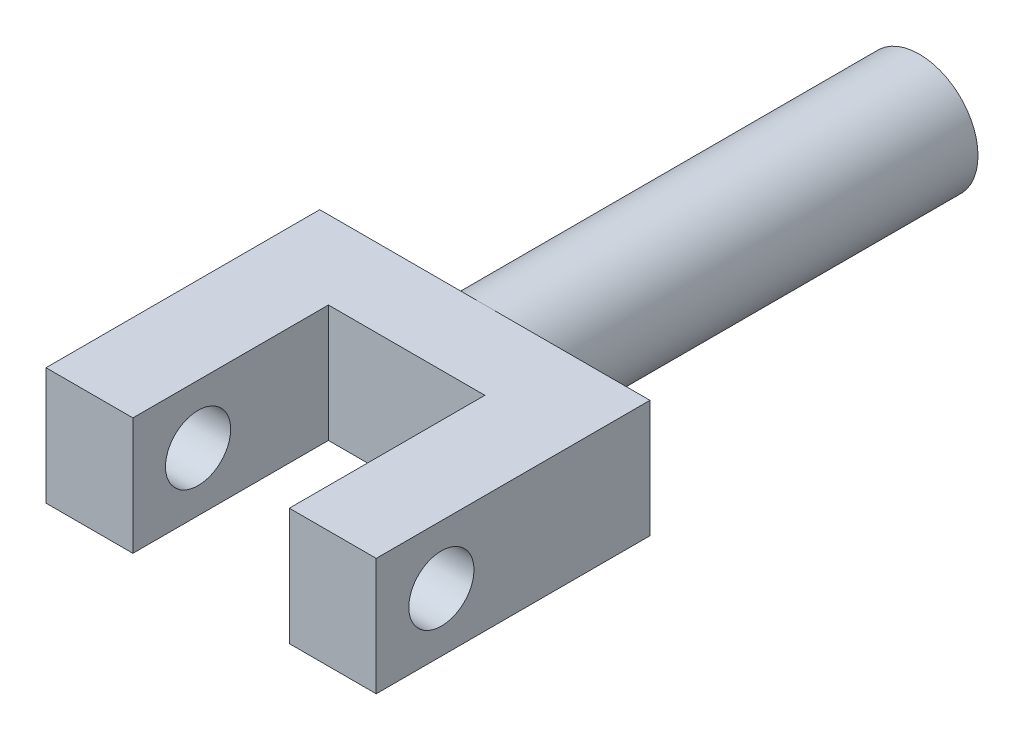
ISO-10303-21;
HEADER;
FILE_DESCRIPTION(('STEP AP214'),'2;1');
FILE_NAME('part.step','',(''),(''),'','','');
FILE_SCHEMA(('AUTOMOTIVE_DESIGN { 1 0 10303 214 1 1 1 1 }'));
ENDSEC;
DATA;
#1=APPLICATION_CONTEXT('core data for automotive mechanical design processes');
#2=APPLICATION_PROTOCOL_DEFINITION('international standard','automotive_design',2000,#1);
#3=PRODUCT_CONTEXT('',#1,'mechanical');
#4=PRODUCT('Part','Part','',(#3));
#5=PRODUCT_RELATED_PRODUCT_CATEGORY('part','',(#4));
#6=PRODUCT_DEFINITION_FORMATION('','',#4);
#7=PRODUCT_DEFINITION_CONTEXT('part definition',#1,'design');
#8=PRODUCT_DEFINITION('design','',#6,#7);
#9=PRODUCT_DEFINITION_SHAPE('','',#8);
#10=(LENGTH_UNIT() NAMED_UNIT(*) SI_UNIT(.MILLI.,.METRE.));
#11=(NAMED_UNIT(*) PLANE_ANGLE_UNIT() SI_UNIT($,.RADIAN.));
#12=(NAMED_UNIT(*) SI_UNIT($,.STERADIAN.) SOLID_ANGLE_UNIT());
#13=UNCERTAINTY_MEASURE_WITH_UNIT(LENGTH_MEASURE(1.E-05),#10,'distance_accuracy_value','');
#14=(GEOMETRIC_REPRESENTATION_CONTEXT(3) GLOBAL_UNCERTAINTY_ASSIGNED_CONTEXT((#13)) GLOBAL_UNIT_ASSIGNED_CONTEXT((#10,
#11,#12)) REPRESENTATION_CONTEXT('',''));
#15=CARTESIAN_POINT('',(0.,0.,0.));
#16=DIRECTION('',(0.,0.,1.));
#17=DIRECTION('',(1.,0.,0.));
#18=AXIS2_PLACEMENT_3D('',#15,#16,#17);
#19=CARTESIAN_POINT('',(0.,0.,10.));
#20=DIRECTION('',(0.,0.,-1.));
#21=DIRECTION('',(-1.,0.,0.));
#22=AXIS2_PLACEMENT_3D('',#19,#20,#21);
#23=CYLINDRICAL_SURFACE('',#22,1.35);
#24=CARTESIAN_POINT('',(0.,0.,10.));
#25=DIRECTION('',(0.,0.,1.));
#26=DIRECTION('',(1.,0.,0.));
#27=AXIS2_PLACEMENT_3D('',#24,#25,#26);
#28=CIRCLE('',#27,1.35);
#29=CARTESIAN_POINT('',(0.,1.35,10.));
#30=VERTEX_POINT('',#29);
#31=CARTESIAN_POINT('',(0.,-1.35,10.));
#32=VERTEX_POINT('',#31);
#33=EDGE_CURVE('E11',#30,#32,#28,.T.);
#34=ORIENTED_EDGE('',*,*,#33,.F.);
#35=EDGE_CURVE('E48',#32,#30,#28,.T.);
#36=ORIENTED_EDGE('',*,*,#35,.F.);
#37=EDGE_LOOP('',(#34,#36));
#38=FACE_BOUND('',#37,.T.);
#39=CARTESIAN_POINT('',(0.,0.,0.));
#40=DIRECTION('',(0.,0.,1.));
#41=DIRECTION('',(1.,0.,0.));
#42=AXIS2_PLACEMENT_3D('',#39,#40,#41);
#43=CIRCLE('',#42,1.35);
#44=CARTESIAN_POINT('',(1.35,0.,0.));
#45=VERTEX_POINT('',#44);
#46=EDGE_CURVE('E194',#45,#45,#43,.T.);
#47=ORIENTED_EDGE('',*,*,#46,.T.);
#48=EDGE_LOOP('',(#47));
#49=FACE_BOUND('',#48,.T.);
#50=ADVANCED_FACE('F39',(#38,#49),#23,.T.);
#51=CARTESIAN_POINT('',(0.,0.,0.));
#52=DIRECTION('',(0.,0.,1.));
#53=DIRECTION('',(1.,0.,0.));
#54=AXIS2_PLACEMENT_3D('',#51,#52,#53);
#55=PLANE('',#54);
#56=ORIENTED_EDGE('',*,*,#46,.F.);
#57=EDGE_LOOP('',(#56));
#58=FACE_BOUND('',#57,.T.);
#59=ADVANCED_FACE('F255',(#58),#55,.F.);
#60=CARTESIAN_POINT('',(0.,-1.35,10.));
#61=DIRECTION('',(0.,0.,-1.));
#62=DIRECTION('',(-1.,0.,0.));
#63=AXIS2_PLACEMENT_3D('',#60,#61,#62);
#64=PLANE('',#63);
#65=DIRECTION('',(-1.,0.,0.));
#66=VECTOR('',#65,1.);
#67=CARTESIAN_POINT('',(3.8,1.35,10.));
#68=LINE('',#67,#66);
#69=CARTESIAN_POINT('',(-3.8,1.35,10.));
#70=VERTEX_POINT('',#69);
#71=EDGE_CURVE('E107',#30,#70,#68,.T.);
#72=ORIENTED_EDGE('',*,*,#71,.F.);
#73=ORIENTED_EDGE('',*,*,#33,.T.);
#74=DIRECTION('',(-1.,0.,0.));
#75=VECTOR('',#74,1.);
#76=CARTESIAN_POINT('',(3.8,-1.35,10.));
#77=LINE('',#76,#75);
#78=CARTESIAN_POINT('',(-3.8,-1.35,10.));
#79=VERTEX_POINT('',#78);
#80=EDGE_CURVE('E125',#32,#79,#77,.T.);
#81=ORIENTED_EDGE('',*,*,#80,.T.);
#82=DIRECTION('',(0.,1.,0.));
#83=VECTOR('',#82,1.);
#84=CARTESIAN_POINT('',(-3.8,-1.35,10.));
#85=LINE('',#84,#83);
#86=EDGE_CURVE('E122',#79,#70,#85,.T.);
#87=ORIENTED_EDGE('',*,*,#86,.T.);
#88=EDGE_LOOP('',(#72,#73,#81,#87));
#89=FACE_BOUND('',#88,.T.);
#90=ADVANCED_FACE('F123',(#89),#64,.T.);
#91=CARTESIAN_POINT('',(3.8,-1.35,16.3));
#92=DIRECTION('',(1.,0.,0.));
#93=DIRECTION('',(0.,0.,-1.));
#94=AXIS2_PLACEMENT_3D('',#91,#92,#93);
#95=PLANE('',#94);
#96=CARTESIAN_POINT('',(3.8,0.,14.8));
#97=DIRECTION('',(1.,0.,0.));
#98=DIRECTION('',(0.,0.,-1.));
#99=AXIS2_PLACEMENT_3D('',#96,#97,#98);
#100=CIRCLE('',#99,0.75);
#101=CARTESIAN_POINT('',(3.8,0.,15.55));
#102=VERTEX_POINT('',#101);
#103=EDGE_CURVE('E119',#102,#102,#100,.F.);
#104=ORIENTED_EDGE('',*,*,#103,.T.);
#105=EDGE_LOOP('',(#104));
#106=FACE_BOUND('',#105,.T.);
#107=DIRECTION('',(0.,1.,0.));
#108=VECTOR('',#107,1.);
#109=CARTESIAN_POINT('',(3.8,-1.35,10.));
#110=LINE('',#109,#108);
#111=CARTESIAN_POINT('',(3.8,-1.35,10.));
#112=VERTEX_POINT('',#111);
#113=CARTESIAN_POINT('',(3.8,1.35,10.));
#114=VERTEX_POINT('',#113);
#115=EDGE_CURVE('E191',#112,#114,#110,.T.);
#116=ORIENTED_EDGE('',*,*,#115,.T.);
#117=DIRECTION('',(0.,0.,-1.));
#118=VECTOR('',#117,1.);
#119=CARTESIAN_POINT('',(3.8,1.35,16.3));
#120=LINE('',#119,#118);
#121=CARTESIAN_POINT('',(3.8,1.35,16.3));
#122=VERTEX_POINT('',#121);
#123=EDGE_CURVE('E158',#122,#114,#120,.T.);
#124=ORIENTED_EDGE('',*,*,#123,.F.);
#125=DIRECTION('',(0.,1.,0.));
#126=VECTOR('',#125,1.);
#127=CARTESIAN_POINT('',(3.8,-1.35,16.3));
#128=LINE('',#127,#126);
#129=CARTESIAN_POINT('',(3.8,-1.35,16.3));
#130=VERTEX_POINT('',#129);
#131=EDGE_CURVE('E195',#130,#122,#128,.T.);
#132=ORIENTED_EDGE('',*,*,#131,.F.);
#133=DIRECTION('',(0.,0.,-1.));
#134=VECTOR('',#133,1.);
#135=CARTESIAN_POINT('',(3.8,-1.35,16.3));
#136=LINE('',#135,#134);
#137=EDGE_CURVE('E131',#130,#112,#136,.T.);
#138=ORIENTED_EDGE('',*,*,#137,.T.);
#139=EDGE_LOOP('',(#116,#124,#132,#138));
#140=FACE_BOUND('',#139,.T.);
#141=ADVANCED_FACE('F224',(#106,#140),#95,.T.);
#142=CARTESIAN_POINT('',(1.8,-1.35,16.3));
#143=DIRECTION('',(0.,0.,1.));
#144=DIRECTION('',(1.,0.,0.));
#145=AXIS2_PLACEMENT_3D('',#142,#143,#144);
#146=PLANE('',#145);
#147=ORIENTED_EDGE('',*,*,#131,.T.);
#148=DIRECTION('',(1.,0.,0.));
#149=VECTOR('',#148,1.);
#150=CARTESIAN_POINT('',(1.8,1.35,16.3));
#151=LINE('',#150,#149);
#152=CARTESIAN_POINT('',(1.8,1.35,16.3));
#153=VERTEX_POINT('',#152);
#154=EDGE_CURVE('E154',#153,#122,#151,.T.);
#155=ORIENTED_EDGE('',*,*,#154,.F.);
#156=DIRECTION('',(0.,1.,0.));
#157=VECTOR('',#156,1.);
#158=CARTESIAN_POINT('',(1.8,-1.35,16.3));
#159=LINE('',#158,#157);
#160=CARTESIAN_POINT('',(1.8,-1.35,16.3));
#161=VERTEX_POINT('',#160);
#162=EDGE_CURVE('E198',#161,#153,#159,.T.);
#163=ORIENTED_EDGE('',*,*,#162,.F.);
#164=DIRECTION('',(1.,0.,0.));
#165=VECTOR('',#164,1.);
#166=CARTESIAN_POINT('',(1.8,-1.35,16.3));
#167=LINE('',#166,#165);
#168=EDGE_CURVE('E184',#161,#130,#167,.T.);
#169=ORIENTED_EDGE('',*,*,#168,.T.);
#170=EDGE_LOOP('',(#147,#155,#163,#169));
#171=FACE_BOUND('',#170,.T.);
#172=ADVANCED_FACE('F228',(#171),#146,.T.);
#173=CARTESIAN_POINT('',(1.8,-1.35,11.8));
#174=DIRECTION('',(-1.,0.,0.));
#175=DIRECTION('',(0.,0.,1.));
#176=AXIS2_PLACEMENT_3D('',#173,#174,#175);
#177=PLANE('',#176);
#178=CARTESIAN_POINT('',(1.8,0.,14.8));
#179=DIRECTION('',(-1.,0.,0.));
#180=DIRECTION('',(0.,0.,1.));
#181=AXIS2_PLACEMENT_3D('',#178,#179,#180);
#182=CIRCLE('',#181,0.75);
#183=CARTESIAN_POINT('',(1.8,0.,15.55));
#184=VERTEX_POINT('',#183);
#185=EDGE_CURVE('E332',#184,#184,#182,.F.);
#186=ORIENTED_EDGE('',*,*,#185,.T.);
#187=EDGE_LOOP('',(#186));
#188=FACE_BOUND('',#187,.T.);
#189=ORIENTED_EDGE('',*,*,#162,.T.);
#190=DIRECTION('',(0.,0.,1.));
#191=VECTOR('',#190,1.);
#192=CARTESIAN_POINT('',(1.8,1.35,11.8));
#193=LINE('',#192,#191);
#194=CARTESIAN_POINT('',(1.8,1.35,11.8));
#195=VERTEX_POINT('',#194);
#196=EDGE_CURVE('E150',#195,#153,#193,.T.);
#197=ORIENTED_EDGE('',*,*,#196,.F.);
#198=DIRECTION('',(0.,1.,0.));
#199=VECTOR('',#198,1.);
#200=CARTESIAN_POINT('',(1.8,-1.35,11.8));
#201=LINE('',#200,#199);
#202=CARTESIAN_POINT('',(1.8,-1.35,11.8));
#203=VERTEX_POINT('',#202);
#204=EDGE_CURVE('E201',#203,#195,#201,.T.);
#205=ORIENTED_EDGE('',*,*,#204,.F.);
#206=DIRECTION('',(0.,0.,1.));
#207=VECTOR('',#206,1.);
#208=CARTESIAN_POINT('',(1.8,-1.35,11.8));
#209=LINE('',#208,#207);
#210=EDGE_CURVE('E180',#203,#161,#209,.T.);
#211=ORIENTED_EDGE('',*,*,#210,.T.);
#212=EDGE_LOOP('',(#189,#197,#205,#211));
#213=FACE_BOUND('',#212,.T.);
#214=ADVANCED_FACE('F232',(#188,#213),#177,.T.);
#215=CARTESIAN_POINT('',(-1.8,-1.35,11.8));
#216=DIRECTION('',(0.,0.,1.));
#217=DIRECTION('',(1.,0.,0.));
#218=AXIS2_PLACEMENT_3D('',#215,#216,#217);
#219=PLANE('',#218);
#220=ORIENTED_EDGE('',*,*,#204,.T.);
#221=DIRECTION('',(1.,0.,0.));
#222=VECTOR('',#221,1.);
#223=CARTESIAN_POINT('',(-1.8,1.35,11.8));
#224=LINE('',#223,#222);
#225=CARTESIAN_POINT('',(-1.8,1.35,11.8));
#226=VERTEX_POINT('',#225);
#227=EDGE_CURVE('E146',#226,#195,#224,.T.);
#228=ORIENTED_EDGE('',*,*,#227,.F.);
#229=DIRECTION('',(0.,1.,0.));
#230=VECTOR('',#229,1.);
#231=CARTESIAN_POINT('',(-1.8,-1.35,11.8));
#232=LINE('',#231,#230);
#233=CARTESIAN_POINT('',(-1.8,-1.35,11.8));
#234=VERTEX_POINT('',#233);
#235=EDGE_CURVE('E204',#234,#226,#232,.T.);
#236=ORIENTED_EDGE('',*,*,#235,.F.);
#237=DIRECTION('',(1.,0.,0.));
#238=VECTOR('',#237,1.);
#239=CARTESIAN_POINT('',(-1.8,-1.35,11.8));
#240=LINE('',#239,#238);
#241=EDGE_CURVE('E176',#234,#203,#240,.T.);
#242=ORIENTED_EDGE('',*,*,#241,.T.);
#243=EDGE_LOOP('',(#220,#228,#236,#242));
#244=FACE_BOUND('',#243,.T.);
#245=ADVANCED_FACE('F236',(#244),#219,.T.);
#246=CARTESIAN_POINT('',(-1.8,-1.35,16.3));
#247=DIRECTION('',(1.,0.,0.));
#248=DIRECTION('',(0.,0.,-1.));
#249=AXIS2_PLACEMENT_3D('',#246,#247,#248);
#250=PLANE('',#249);
#251=CARTESIAN_POINT('',(-1.8,0.,14.8));
#252=DIRECTION('',(1.,0.,0.));
#253=DIRECTION('',(0.,0.,-1.));
#254=AXIS2_PLACEMENT_3D('',#251,#252,#253);
#255=CIRCLE('',#254,0.75);
#256=CARTESIAN_POINT('',(-1.8,0.,15.55));
#257=VERTEX_POINT('',#256);
#258=EDGE_CURVE('E334',#257,#257,#255,.F.);
#259=ORIENTED_EDGE('',*,*,#258,.T.);
#260=EDGE_LOOP('',(#259));
#261=FACE_BOUND('',#260,.T.);
#262=ORIENTED_EDGE('',*,*,#235,.T.);
#263=DIRECTION('',(0.,0.,-1.));
#264=VECTOR('',#263,1.);
#265=CARTESIAN_POINT('',(-1.8,1.35,16.3));
#266=LINE('',#265,#264);
#267=CARTESIAN_POINT('',(-1.8,1.35,16.3));
#268=VERTEX_POINT('',#267);
#269=EDGE_CURVE('E139',#268,#226,#266,.T.);
#270=ORIENTED_EDGE('',*,*,#269,.F.);
#271=DIRECTION('',(0.,1.,0.));
#272=VECTOR('',#271,1.);
#273=CARTESIAN_POINT('',(-1.8,-1.35,16.3));
#274=LINE('',#273,#272);
#275=CARTESIAN_POINT('',(-1.8,-1.35,16.3));
#276=VERTEX_POINT('',#275);
#277=EDGE_CURVE('E207',#276,#268,#274,.T.);
#278=ORIENTED_EDGE('',*,*,#277,.F.);
#279=DIRECTION('',(0.,0.,-1.));
#280=VECTOR('',#279,1.);
#281=CARTESIAN_POINT('',(-1.8,-1.35,16.3));
#282=LINE('',#281,#280);
#283=EDGE_CURVE('E172',#276,#234,#282,.T.);
#284=ORIENTED_EDGE('',*,*,#283,.T.);
#285=EDGE_LOOP('',(#262,#270,#278,#284));
#286=FACE_BOUND('',#285,.T.);
#287=ADVANCED_FACE('F239',(#261,#286),#250,.T.);
#288=CARTESIAN_POINT('',(-3.8,-1.35,16.3));
#289=DIRECTION('',(0.,0.,1.));
#290=DIRECTION('',(1.,0.,0.));
#291=AXIS2_PLACEMENT_3D('',#288,#289,#290);
#292=PLANE('',#291);
#293=ORIENTED_EDGE('',*,*,#277,.T.);
#294=DIRECTION('',(1.,0.,0.));
#295=VECTOR('',#294,1.);
#296=CARTESIAN_POINT('',(-3.8,1.35,16.3));
#297=LINE('',#296,#295);
#298=CARTESIAN_POINT('',(-3.8,1.35,16.3));
#299=VERTEX_POINT('',#298);
#300=EDGE_CURVE('E135',#299,#268,#297,.T.);
#301=ORIENTED_EDGE('',*,*,#300,.F.);
#302=DIRECTION('',(0.,1.,0.));
#303=VECTOR('',#302,1.);
#304=CARTESIAN_POINT('',(-3.8,-1.35,16.3));
#305=LINE('',#304,#303);
#306=CARTESIAN_POINT('',(-3.8,-1.35,16.3));
#307=VERTEX_POINT('',#306);
#308=EDGE_CURVE('E130',#307,#299,#305,.T.);
#309=ORIENTED_EDGE('',*,*,#308,.F.);
#310=DIRECTION('',(1.,0.,0.));
#311=VECTOR('',#310,1.);
#312=CARTESIAN_POINT('',(-3.8,-1.35,16.3));
#313=LINE('',#312,#311);
#314=EDGE_CURVE('E168',#307,#276,#313,.T.);
#315=ORIENTED_EDGE('',*,*,#314,.T.);
#316=EDGE_LOOP('',(#293,#301,#309,#315));
#317=FACE_BOUND('',#316,.T.);
#318=ADVANCED_FACE('F243',(#317),#292,.T.);
#319=CARTESIAN_POINT('',(-3.8,-1.35,10.));
#320=DIRECTION('',(-1.,0.,0.));
#321=DIRECTION('',(0.,0.,1.));
#322=AXIS2_PLACEMENT_3D('',#319,#320,#321);
#323=PLANE('',#322);
#324=CARTESIAN_POINT('',(-3.8,0.,14.8));
#325=DIRECTION('',(-1.,0.,0.));
#326=DIRECTION('',(0.,0.,1.));
#327=AXIS2_PLACEMENT_3D('',#324,#325,#326);
#328=CIRCLE('',#327,0.75);
#329=CARTESIAN_POINT('',(-3.8,0.,15.55));
#330=VERTEX_POINT('',#329);
#331=EDGE_CURVE('E42',#330,#330,#328,.F.);
#332=ORIENTED_EDGE('',*,*,#331,.T.);
#333=EDGE_LOOP('',(#332));
#334=FACE_BOUND('',#333,.T.);
#335=ORIENTED_EDGE('',*,*,#308,.T.);
#336=DIRECTION('',(0.,0.,1.));
#337=VECTOR('',#336,1.);
#338=CARTESIAN_POINT('',(-3.8,1.35,10.));
#339=LINE('',#338,#337);
#340=EDGE_CURVE('E112',#70,#299,#339,.T.);
#341=ORIENTED_EDGE('',*,*,#340,.F.);
#342=ORIENTED_EDGE('',*,*,#86,.F.);
#343=DIRECTION('',(0.,0.,1.));
#344=VECTOR('',#343,1.);
#345=CARTESIAN_POINT('',(-3.8,-1.35,10.));
#346=LINE('',#345,#344);
#347=EDGE_CURVE('E165',#79,#307,#346,.T.);
#348=ORIENTED_EDGE('',*,*,#347,.T.);
#349=EDGE_LOOP('',(#335,#341,#342,#348));
#350=FACE_BOUND('',#349,.T.);
#351=ADVANCED_FACE('F133',(#334,#350),#323,.T.);
#352=EDGE_CURVE('E161',#112,#32,#77,.T.);
#353=ORIENTED_EDGE('',*,*,#352,.T.);
#354=ORIENTED_EDGE('',*,*,#35,.T.);
#355=EDGE_CURVE('E116',#114,#30,#68,.T.);
#356=ORIENTED_EDGE('',*,*,#355,.F.);
#357=ORIENTED_EDGE('',*,*,#115,.F.);
#358=EDGE_LOOP('',(#353,#354,#356,#357));
#359=FACE_BOUND('',#358,.T.);
#360=ADVANCED_FACE('F217',(#359),#64,.T.);
#361=CARTESIAN_POINT('',(0.,-1.35,0.));
#362=DIRECTION('',(0.,1.,0.));
#363=DIRECTION('',(0.,0.,1.));
#364=AXIS2_PLACEMENT_3D('',#361,#362,#363);
#365=PLANE('',#364);
#366=ORIENTED_EDGE('',*,*,#352,.F.);
#367=ORIENTED_EDGE('',*,*,#137,.F.);
#368=ORIENTED_EDGE('',*,*,#168,.F.);
#369=ORIENTED_EDGE('',*,*,#210,.F.);
#370=ORIENTED_EDGE('',*,*,#241,.F.);
#371=ORIENTED_EDGE('',*,*,#283,.F.);
#372=ORIENTED_EDGE('',*,*,#314,.F.);
#373=ORIENTED_EDGE('',*,*,#347,.F.);
#374=ORIENTED_EDGE('',*,*,#80,.F.);
#375=EDGE_LOOP('',(#366,#367,#368,#369,#370,#371,#372,#373,#374));
#376=FACE_BOUND('',#375,.T.);
#377=ADVANCED_FACE('F221',(#376),#365,.F.);
#378=CARTESIAN_POINT('',(0.,1.35,0.));
#379=DIRECTION('',(0.,1.,0.));
#380=DIRECTION('',(0.,0.,1.));
#381=AXIS2_PLACEMENT_3D('',#378,#379,#380);
#382=PLANE('',#381);
#383=ORIENTED_EDGE('',*,*,#355,.T.);
#384=ORIENTED_EDGE('',*,*,#71,.T.);
#385=ORIENTED_EDGE('',*,*,#340,.T.);
#386=ORIENTED_EDGE('',*,*,#300,.T.);
#387=ORIENTED_EDGE('',*,*,#269,.T.);
#388=ORIENTED_EDGE('',*,*,#227,.T.);
#389=ORIENTED_EDGE('',*,*,#196,.T.);
#390=ORIENTED_EDGE('',*,*,#154,.T.);
#391=ORIENTED_EDGE('',*,*,#123,.T.);
#392=EDGE_LOOP('',(#383,#384,#385,#386,#387,#388,#389,#390,#391));
#393=FACE_BOUND('',#392,.T.);
#394=ADVANCED_FACE('F109',(#393),#382,.T.);
#395=CARTESIAN_POINT('',(9.45,0.,14.8));
#396=DIRECTION('',(-1.,0.,0.));
#397=DIRECTION('',(0.,0.,1.));
#398=AXIS2_PLACEMENT_3D('',#395,#396,#397);
#399=CYLINDRICAL_SURFACE('',#398,0.75);
#400=CARTESIAN_POINT('',(-1.8,0.,15.55));
#401=CARTESIAN_POINT('',(-1.82083333333333,0.,15.55));
#402=CARTESIAN_POINT('',(-1.84166666666666,0.,15.55));
#403=CARTESIAN_POINT('',(-1.88333333333333,0.,15.55));
#404=CARTESIAN_POINT('',(-1.90416666666666,0.,15.55));
#405=CARTESIAN_POINT('',(-1.94583333333333,0.,15.55));
#406=CARTESIAN_POINT('',(-1.96666666666666,0.,15.55));
#407=CARTESIAN_POINT('',(-2.00833333333333,0.,15.55));
#408=CARTESIAN_POINT('',(-2.02916666666667,0.,15.55));
#409=CARTESIAN_POINT('',(-2.07083333333333,0.,15.55));
#410=CARTESIAN_POINT('',(-2.09166666666667,0.,15.55));
#411=CARTESIAN_POINT('',(-2.13333333333333,0.,15.55));
#412=CARTESIAN_POINT('',(-2.15416666666667,0.,15.55));
#413=CARTESIAN_POINT('',(-2.19583333333333,0.,15.55));
#414=CARTESIAN_POINT('',(-2.21666666666667,0.,15.55));
#415=CARTESIAN_POINT('',(-2.25833333333333,0.,15.55));
#416=CARTESIAN_POINT('',(-2.27916666666667,0.,15.55));
#417=CARTESIAN_POINT('',(-2.32083333333333,0.,15.55));
#418=CARTESIAN_POINT('',(-2.34166666666667,0.,15.55));
#419=CARTESIAN_POINT('',(-2.38333333333333,0.,15.55));
#420=CARTESIAN_POINT('',(-2.40416666666667,0.,15.55));
#421=CARTESIAN_POINT('',(-2.44583333333333,0.,15.55));
#422=CARTESIAN_POINT('',(-2.46666666666667,0.,15.55));
#423=CARTESIAN_POINT('',(-2.50833333333333,0.,15.55));
#424=CARTESIAN_POINT('',(-2.52916666666667,0.,15.55));
#425=CARTESIAN_POINT('',(-2.57083333333333,0.,15.55));
#426=CARTESIAN_POINT('',(-2.59166666666667,0.,15.55));
#427=CARTESIAN_POINT('',(-2.63333333333333,0.,15.55));
#428=CARTESIAN_POINT('',(-2.65416666666667,0.,15.55));
#429=CARTESIAN_POINT('',(-2.69583333333333,0.,15.55));
#430=CARTESIAN_POINT('',(-2.71666666666667,0.,15.55));
#431=CARTESIAN_POINT('',(-2.75833333333333,0.,15.55));
#432=CARTESIAN_POINT('',(-2.77916666666667,0.,15.55));
#433=CARTESIAN_POINT('',(-2.82083333333333,0.,15.55));
#434=CARTESIAN_POINT('',(-2.84166666666667,0.,15.55));
#435=CARTESIAN_POINT('',(-2.88333333333333,0.,15.55));
#436=CARTESIAN_POINT('',(-2.90416666666667,0.,15.55));
#437=CARTESIAN_POINT('',(-2.94583333333333,0.,15.55));
#438=CARTESIAN_POINT('',(-2.96666666666667,0.,15.55));
#439=CARTESIAN_POINT('',(-3.00833333333333,0.,15.55));
#440=CARTESIAN_POINT('',(-3.02916666666667,0.,15.55));
#441=CARTESIAN_POINT('',(-3.07083333333333,0.,15.55));
#442=CARTESIAN_POINT('',(-3.09166666666667,0.,15.55));
#443=CARTESIAN_POINT('',(-3.13333333333333,0.,15.55));
#444=CARTESIAN_POINT('',(-3.15416666666667,0.,15.55));
#445=CARTESIAN_POINT('',(-3.19583333333333,0.,15.55));
#446=CARTESIAN_POINT('',(-3.21666666666667,0.,15.55));
#447=CARTESIAN_POINT('',(-3.25833333333333,0.,15.55));
#448=CARTESIAN_POINT('',(-3.27916666666667,0.,15.55));
#449=CARTESIAN_POINT('',(-3.32083333333333,0.,15.55));
#450=CARTESIAN_POINT('',(-3.34166666666667,0.,15.55));
#451=CARTESIAN_POINT('',(-3.38333333333333,0.,15.55));
#452=CARTESIAN_POINT('',(-3.40416666666667,0.,15.55));
#453=CARTESIAN_POINT('',(-3.44583333333333,0.,15.55));
#454=CARTESIAN_POINT('',(-3.46666666666667,0.,15.55));
#455=CARTESIAN_POINT('',(-3.50833333333333,0.,15.55));
#456=CARTESIAN_POINT('',(-3.52916666666667,0.,15.55));
#457=CARTESIAN_POINT('',(-3.57083333333333,0.,15.55));
#458=CARTESIAN_POINT('',(-3.59166666666667,0.,15.55));
#459=CARTESIAN_POINT('',(-3.63333333333333,0.,15.55));
#460=CARTESIAN_POINT('',(-3.65416666666667,0.,15.55));
#461=CARTESIAN_POINT('',(-3.69583333333333,0.,15.55));
#462=CARTESIAN_POINT('',(-3.71666666666667,0.,15.55));
#463=CARTESIAN_POINT('',(-3.75833333333333,0.,15.55));
#464=CARTESIAN_POINT('',(-3.77916666666667,0.,15.55));
#465=CARTESIAN_POINT('',(-3.8,0.,15.55));
#466=B_SPLINE_CURVE_WITH_KNOTS('',3,(#400,#401,#402,#403,#404,#405,#406,#407,#408,#409,#410,
#411,#412,#413,#414,#415,#416,#417,#418,#419,#420,#421,#422,#423,#424,#425,#426,#427,#428,#429,
#430,#431,#432,#433,#434,#435,#436,#437,#438,#439,#440,#441,#442,#443,#444,#445,#446,#447,#448,
#449,#450,#451,#452,#453,#454,#455,#456,#457,#458,#459,#460,#461,#462,#463,#464,#465),
.UNSPECIFIED.,.F.,.F.,(4,2,2,2,2,2,2,2,2,2,2,2,2,2,2,2,2,2,2,2,2,2,2,2,2,2,2,2,2,2,2,2,4),(0.,
0.0625000000000001,0.125,0.1875,0.25,0.3125,0.375,0.4375,0.5,0.5625,0.625000000000001,
0.687500000000001,0.750000000000001,0.812500000000001,0.875000000000001,0.937500000000001,1.,
1.0625,1.125,1.1875,1.25,1.3125,1.375,1.4375,1.5,1.5625,1.625,1.6875,1.75,1.8125,1.875,1.9375,
2.),.UNSPECIFIED.);
#467=EDGE_CURVE('BSEAM272',#257,#330,#466,.T.);
#468=ORIENTED_EDGE('',*,*,#258,.F.);
#469=ORIENTED_EDGE('',*,*,#331,.F.);
#470=ORIENTED_EDGE('',*,*,#467,.T.);
#471=ORIENTED_EDGE('',*,*,#467,.F.);
#472=EDGE_LOOP('',(#468,#470,#469,#471));
#473=FACE_BOUND('',#472,.T.);
#474=ADVANCED_FACE('F272',(#473),#399,.F.);
#475=CARTESIAN_POINT('',(3.8,0.,15.55));
#476=CARTESIAN_POINT('',(3.77916666666667,0.,15.55));
#477=CARTESIAN_POINT('',(3.75833333333333,0.,15.55));
#478=CARTESIAN_POINT('',(3.71666666666667,0.,15.55));
#479=CARTESIAN_POINT('',(3.69583333333333,0.,15.55));
#480=CARTESIAN_POINT('',(3.65416666666667,0.,15.55));
#481=CARTESIAN_POINT('',(3.63333333333333,0.,15.55));
#482=CARTESIAN_POINT('',(3.59166666666667,0.,15.55));
#483=CARTESIAN_POINT('',(3.57083333333333,0.,15.55));
#484=CARTESIAN_POINT('',(3.52916666666667,0.,15.55));
#485=CARTESIAN_POINT('',(3.50833333333333,0.,15.55));
#486=CARTESIAN_POINT('',(3.46666666666667,0.,15.55));
#487=CARTESIAN_POINT('',(3.44583333333333,0.,15.55));
#488=CARTESIAN_POINT('',(3.40416666666667,0.,15.55));
#489=CARTESIAN_POINT('',(3.38333333333333,0.,15.55));
#490=CARTESIAN_POINT('',(3.34166666666667,0.,15.55));
#491=CARTESIAN_POINT('',(3.32083333333333,0.,15.55));
#492=CARTESIAN_POINT('',(3.27916666666667,0.,15.55));
#493=CARTESIAN_POINT('',(3.25833333333333,0.,15.55));
#494=CARTESIAN_POINT('',(3.21666666666667,0.,15.55));
#495=CARTESIAN_POINT('',(3.19583333333333,0.,15.55));
#496=CARTESIAN_POINT('',(3.15416666666667,0.,15.55));
#497=CARTESIAN_POINT('',(3.13333333333333,0.,15.55));
#498=CARTESIAN_POINT('',(3.09166666666667,0.,15.55));
#499=CARTESIAN_POINT('',(3.07083333333333,0.,15.55));
#500=CARTESIAN_POINT('',(3.02916666666667,0.,15.55));
#501=CARTESIAN_POINT('',(3.00833333333333,0.,15.55));
#502=CARTESIAN_POINT('',(2.96666666666667,0.,15.55));
#503=CARTESIAN_POINT('',(2.94583333333333,0.,15.55));
#504=CARTESIAN_POINT('',(2.90416666666667,0.,15.55));
#505=CARTESIAN_POINT('',(2.88333333333333,0.,15.55));
#506=CARTESIAN_POINT('',(2.84166666666667,0.,15.55));
#507=CARTESIAN_POINT('',(2.82083333333333,0.,15.55));
#508=CARTESIAN_POINT('',(2.77916666666667,0.,15.55));
#509=CARTESIAN_POINT('',(2.75833333333333,0.,15.55));
#510=CARTESIAN_POINT('',(2.71666666666667,0.,15.55));
#511=CARTESIAN_POINT('',(2.69583333333333,0.,15.55));
#512=CARTESIAN_POINT('',(2.65416666666667,0.,15.55));
#513=CARTESIAN_POINT('',(2.63333333333333,0.,15.55));
#514=CARTESIAN_POINT('',(2.59166666666667,0.,15.55));
#515=CARTESIAN_POINT('',(2.57083333333333,0.,15.55));
#516=CARTESIAN_POINT('',(2.52916666666667,0.,15.55));
#517=CARTESIAN_POINT('',(2.50833333333333,0.,15.55));
#518=CARTESIAN_POINT('',(2.46666666666667,0.,15.55));
#519=CARTESIAN_POINT('',(2.44583333333333,0.,15.55));
#520=CARTESIAN_POINT('',(2.40416666666667,0.,15.55));
#521=CARTESIAN_POINT('',(2.38333333333333,0.,15.55));
#522=CARTESIAN_POINT('',(2.34166666666667,0.,15.55));
#523=CARTESIAN_POINT('',(2.32083333333333,0.,15.55));
#524=CARTESIAN_POINT('',(2.27916666666667,0.,15.55));
#525=CARTESIAN_POINT('',(2.25833333333333,0.,15.55));
#526=CARTESIAN_POINT('',(2.21666666666667,0.,15.55));
#527=CARTESIAN_POINT('',(2.19583333333333,0.,15.55));
#528=CARTESIAN_POINT('',(2.15416666666667,0.,15.55));
#529=CARTESIAN_POINT('',(2.13333333333333,0.,15.55));
#530=CARTESIAN_POINT('',(2.09166666666667,0.,15.55));
#531=CARTESIAN_POINT('',(2.07083333333333,0.,15.55));
#532=CARTESIAN_POINT('',(2.02916666666667,0.,15.55));
#533=CARTESIAN_POINT('',(2.00833333333333,0.,15.55));
#534=CARTESIAN_POINT('',(1.96666666666667,0.,15.55));
#535=CARTESIAN_POINT('',(1.94583333333333,0.,15.55));
#536=CARTESIAN_POINT('',(1.90416666666667,0.,15.55));
#537=CARTESIAN_POINT('',(1.88333333333333,0.,15.55));
#538=CARTESIAN_POINT('',(1.84166666666667,0.,15.55));
#539=CARTESIAN_POINT('',(1.82083333333333,0.,15.55));
#540=CARTESIAN_POINT('',(1.8,0.,15.55));
#541=B_SPLINE_CURVE_WITH_KNOTS('',3,(#475,#476,#477,#478,#479,#480,#481,#482,#483,#484,#485,
#486,#487,#488,#489,#490,#491,#492,#493,#494,#495,#496,#497,#498,#499,#500,#501,#502,#503,#504,
#505,#506,#507,#508,#509,#510,#511,#512,#513,#514,#515,#516,#517,#518,#519,#520,#521,#522,#523,
#524,#525,#526,#527,#528,#529,#530,#531,#532,#533,#534,#535,#536,#537,#538,#539,#540),
.UNSPECIFIED.,.F.,.F.,(4,2,2,2,2,2,2,2,2,2,2,2,2,2,2,2,2,2,2,2,2,2,2,2,2,2,2,2,2,2,2,2,4),(0.,
0.0625000000000001,0.125,0.1875,0.25,0.3125,0.375,0.4375,0.5,0.5625,0.625,0.6875,0.75,0.8125,
0.875,0.9375,1.,1.0625,1.125,1.1875,1.25,1.3125,1.375,1.4375,1.5,1.5625,1.625,1.6875,1.75,
1.8125,1.875,1.9375,2.),.UNSPECIFIED.);
#542=EDGE_CURVE('BSEAM314',#102,#184,#541,.T.);
#543=ORIENTED_EDGE('',*,*,#103,.F.);
#544=ORIENTED_EDGE('',*,*,#185,.F.);
#545=ORIENTED_EDGE('',*,*,#542,.T.);
#546=ORIENTED_EDGE('',*,*,#542,.F.);
#547=EDGE_LOOP('',(#543,#545,#544,#546));
#548=FACE_BOUND('',#547,.T.);
#549=ADVANCED_FACE('F314',(#548),#399,.F.);
#550=CLOSED_SHELL('',(#50,#59,#90,#141,#172,#214,#245,#287,#318,#351,#360,#377,#394,#474,#549));
#551=MANIFOLD_SOLID_BREP('B2',#550);
#552=ADVANCED_BREP_SHAPE_REPRESENTATION('',(#18,#551),#14);
#553=SHAPE_DEFINITION_REPRESENTATION(#9,#552);
ENDSEC;
END-ISO-10303-21;
